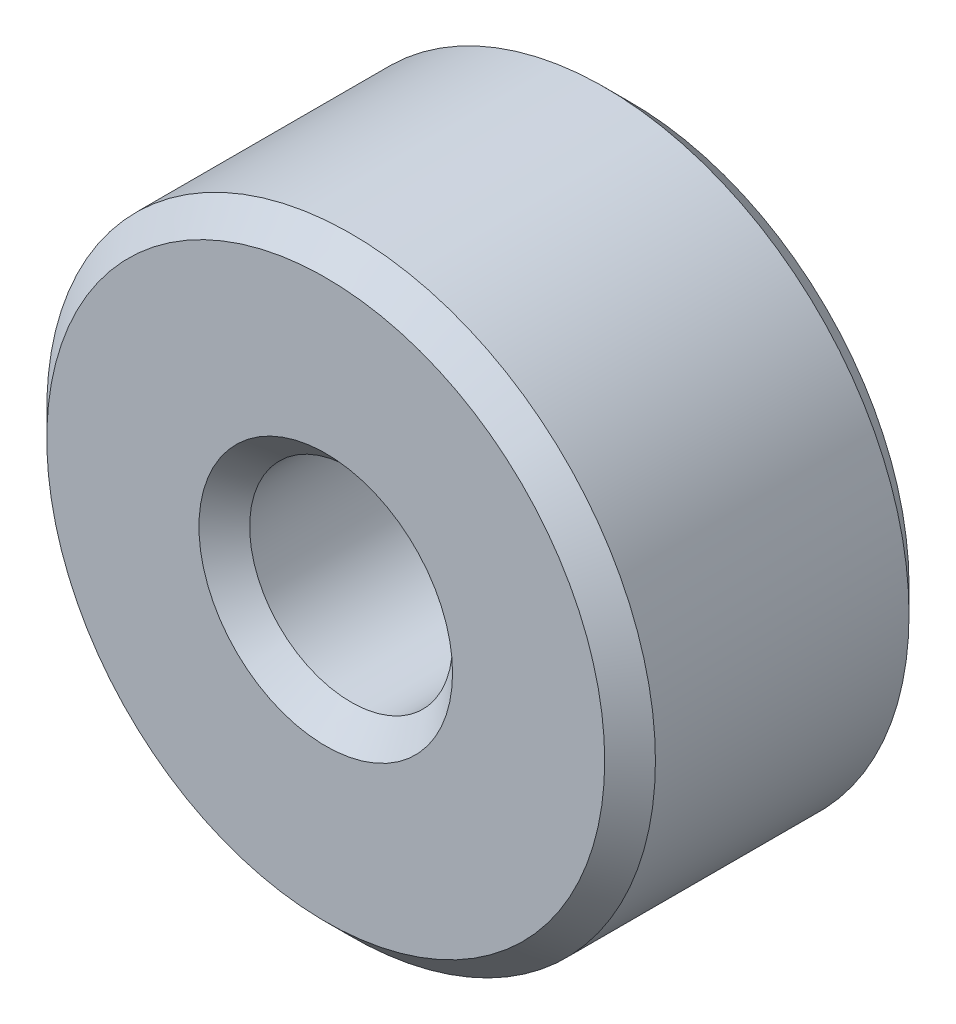
ISO-10303-21;
HEADER;
FILE_DESCRIPTION(('STEP AP214'),'2;1');
FILE_NAME('part.step','',(''),(''),'','','');
FILE_SCHEMA(('AUTOMOTIVE_DESIGN { 1 0 10303 214 1 1 1 1 }'));
ENDSEC;
DATA;
#1=APPLICATION_CONTEXT('core data for automotive mechanical design processes');
#2=APPLICATION_PROTOCOL_DEFINITION('international standard','automotive_design',2000,#1);
#3=PRODUCT_CONTEXT('',#1,'mechanical');
#4=PRODUCT('Part','Part','',(#3));
#5=PRODUCT_RELATED_PRODUCT_CATEGORY('part','',(#4));
#6=PRODUCT_DEFINITION_FORMATION('','',#4);
#7=PRODUCT_DEFINITION_CONTEXT('part definition',#1,'design');
#8=PRODUCT_DEFINITION('design','',#6,#7);
#9=PRODUCT_DEFINITION_SHAPE('','',#8);
#10=(LENGTH_UNIT() NAMED_UNIT(*) SI_UNIT(.MILLI.,.METRE.));
#11=(NAMED_UNIT(*) PLANE_ANGLE_UNIT() SI_UNIT($,.RADIAN.));
#12=(NAMED_UNIT(*) SI_UNIT($,.STERADIAN.) SOLID_ANGLE_UNIT());
#13=UNCERTAINTY_MEASURE_WITH_UNIT(LENGTH_MEASURE(1.E-05),#10,'distance_accuracy_value','');
#14=(GEOMETRIC_REPRESENTATION_CONTEXT(3) GLOBAL_UNCERTAINTY_ASSIGNED_CONTEXT((#13)) GLOBAL_UNIT_ASSIGNED_CONTEXT((#10,
#11,#12)) REPRESENTATION_CONTEXT('',''));
#15=CARTESIAN_POINT('',(0.,0.,0.));
#16=DIRECTION('',(0.,0.,1.));
#17=DIRECTION('',(1.,0.,0.));
#18=AXIS2_PLACEMENT_3D('',#15,#16,#17);
#19=CARTESIAN_POINT('',(0.,0.,3.));
#20=DIRECTION('',(0.,0.,1.));
#21=DIRECTION('',(1.,0.,0.));
#22=AXIS2_PLACEMENT_3D('',#19,#20,#21);
#23=PLANE('',#22);
#24=CARTESIAN_POINT('',(0.,0.,3.));
#25=DIRECTION('',(0.,0.,1.));
#26=DIRECTION('',(1.,0.,0.));
#27=AXIS2_PLACEMENT_3D('',#24,#25,#26);
#28=CIRCLE('',#27,1.25);
#29=CARTESIAN_POINT('',(1.25,0.,3.));
#30=VERTEX_POINT('',#29);
#31=EDGE_CURVE('E60',#30,#30,#28,.F.);
#32=ORIENTED_EDGE('',*,*,#31,.T.);
#33=EDGE_LOOP('',(#32));
#34=FACE_BOUND('',#33,.T.);
#35=CARTESIAN_POINT('',(0.,0.,3.));
#36=DIRECTION('',(0.,0.,1.));
#37=DIRECTION('',(1.,0.,0.));
#38=AXIS2_PLACEMENT_3D('',#35,#36,#37);
#39=CIRCLE('',#38,2.75);
#40=CARTESIAN_POINT('',(2.75,0.,3.));
#41=VERTEX_POINT('',#40);
#42=EDGE_CURVE('E63',#41,#41,#39,.T.);
#43=ORIENTED_EDGE('',*,*,#42,.T.);
#44=EDGE_LOOP('',(#43));
#45=FACE_BOUND('',#44,.T.);
#46=ADVANCED_FACE('F39',(#34,#45),#23,.T.);
#47=CARTESIAN_POINT('',(0.,0.,0.));
#48=DIRECTION('',(0.,0.,1.));
#49=DIRECTION('',(1.,0.,0.));
#50=AXIS2_PLACEMENT_3D('',#47,#48,#49);
#51=PLANE('',#50);
#52=CARTESIAN_POINT('',(0.,0.,0.));
#53=DIRECTION('',(0.,0.,1.));
#54=DIRECTION('',(1.,0.,0.));
#55=AXIS2_PLACEMENT_3D('',#52,#53,#54);
#56=CIRCLE('',#55,1.25);
#57=CARTESIAN_POINT('',(1.25,0.,0.));
#58=VERTEX_POINT('',#57);
#59=EDGE_CURVE('E11',#58,#58,#56,.T.);
#60=ORIENTED_EDGE('',*,*,#59,.T.);
#61=EDGE_LOOP('',(#60));
#62=FACE_BOUND('',#61,.T.);
#63=CARTESIAN_POINT('',(0.,0.,0.));
#64=DIRECTION('',(0.,0.,1.));
#65=DIRECTION('',(1.,0.,0.));
#66=AXIS2_PLACEMENT_3D('',#63,#64,#65);
#67=CIRCLE('',#66,2.75);
#68=CARTESIAN_POINT('',(2.75,0.,0.));
#69=VERTEX_POINT('',#68);
#70=EDGE_CURVE('E47',#69,#69,#67,.F.);
#71=ORIENTED_EDGE('',*,*,#70,.T.);
#72=EDGE_LOOP('',(#71));
#73=FACE_BOUND('',#72,.T.);
#74=ADVANCED_FACE('F89',(#62,#73),#51,.F.);
#75=CARTESIAN_POINT('',(0.,0.,3.));
#76=DIRECTION('',(0.,0.,-1.));
#77=DIRECTION('',(-1.,0.,0.));
#78=AXIS2_PLACEMENT_3D('',#75,#76,#77);
#79=CYLINDRICAL_SURFACE('',#78,3.);
#80=CARTESIAN_POINT('',(0.,0.,2.75));
#81=DIRECTION('',(0.,0.,1.));
#82=DIRECTION('',(1.,0.,0.));
#83=AXIS2_PLACEMENT_3D('',#80,#81,#82);
#84=CIRCLE('',#83,3.);
#85=CARTESIAN_POINT('',(3.,0.,2.75));
#86=VERTEX_POINT('',#85);
#87=EDGE_CURVE('E51',#86,#86,#84,.F.);
#88=ORIENTED_EDGE('',*,*,#87,.T.);
#89=EDGE_LOOP('',(#88));
#90=FACE_BOUND('',#89,.T.);
#91=CARTESIAN_POINT('',(0.,0.,0.250000000000001));
#92=DIRECTION('',(0.,0.,1.));
#93=DIRECTION('',(1.,0.,0.));
#94=AXIS2_PLACEMENT_3D('',#91,#92,#93);
#95=CIRCLE('',#94,3.);
#96=CARTESIAN_POINT('',(3.,0.,0.250000000000001));
#97=VERTEX_POINT('',#96);
#98=EDGE_CURVE('E55',#97,#97,#95,.T.);
#99=ORIENTED_EDGE('',*,*,#98,.T.);
#100=EDGE_LOOP('',(#99));
#101=FACE_BOUND('',#100,.T.);
#102=ADVANCED_FACE('F95',(#90,#101),#79,.T.);
#103=CARTESIAN_POINT('',(0.,0.,3.));
#104=DIRECTION('',(0.,0.,-1.));
#105=DIRECTION('',(-1.,0.,0.));
#106=AXIS2_PLACEMENT_3D('',#103,#104,#105);
#107=CYLINDRICAL_SURFACE('',#106,1.);
#108=CARTESIAN_POINT('',(0.,0.,2.75));
#109=DIRECTION('',(0.,0.,1.));
#110=DIRECTION('',(1.,0.,0.));
#111=AXIS2_PLACEMENT_3D('',#108,#109,#110);
#112=CIRCLE('',#111,1.);
#113=CARTESIAN_POINT('',(1.,0.,2.75));
#114=VERTEX_POINT('',#113);
#115=EDGE_CURVE('E66',#114,#114,#112,.T.);
#116=ORIENTED_EDGE('',*,*,#115,.T.);
#117=EDGE_LOOP('',(#116));
#118=FACE_BOUND('',#117,.T.);
#119=CARTESIAN_POINT('',(0.,0.,0.250000000000001));
#120=DIRECTION('',(0.,0.,1.));
#121=DIRECTION('',(1.,0.,0.));
#122=AXIS2_PLACEMENT_3D('',#119,#120,#121);
#123=CIRCLE('',#122,1.);
#124=CARTESIAN_POINT('',(1.,0.,0.250000000000001));
#125=VERTEX_POINT('',#124);
#126=EDGE_CURVE('E69',#125,#125,#123,.F.);
#127=ORIENTED_EDGE('',*,*,#126,.T.);
#128=EDGE_LOOP('',(#127));
#129=FACE_BOUND('',#128,.T.);
#130=ADVANCED_FACE('F73',(#118,#129),#107,.F.);
#131=CARTESIAN_POINT('',(0.,0.,2.75));
#132=DIRECTION('',(0.,0.,1.));
#133=DIRECTION('',(1.,0.,0.));
#134=AXIS2_PLACEMENT_3D('',#131,#132,#133);
#135=CONICAL_SURFACE('',#134,1.,0.78539816339745);
#136=ORIENTED_EDGE('',*,*,#31,.F.);
#137=EDGE_LOOP('',(#136));
#138=FACE_BOUND('',#137,.T.);
#139=ORIENTED_EDGE('',*,*,#115,.F.);
#140=EDGE_LOOP('',(#139));
#141=FACE_BOUND('',#140,.T.);
#142=ADVANCED_FACE('F84',(#138,#141),#135,.F.);
#143=CARTESIAN_POINT('',(0.,0.,3.));
#144=DIRECTION('',(0.,0.,-1.));
#145=DIRECTION('',(-1.,0.,0.));
#146=AXIS2_PLACEMENT_3D('',#143,#144,#145);
#147=CONICAL_SURFACE('',#146,2.75,0.785398163397447);
#148=ORIENTED_EDGE('',*,*,#87,.F.);
#149=EDGE_LOOP('',(#148));
#150=FACE_BOUND('',#149,.T.);
#151=ORIENTED_EDGE('',*,*,#42,.F.);
#152=EDGE_LOOP('',(#151));
#153=FACE_BOUND('',#152,.T.);
#154=ADVANCED_FACE('F78',(#150,#153),#147,.T.);
#155=CARTESIAN_POINT('',(0.,0.,0.));
#156=DIRECTION('',(0.,0.,-1.));
#157=DIRECTION('',(-1.,0.,0.));
#158=AXIS2_PLACEMENT_3D('',#155,#156,#157);
#159=CONICAL_SURFACE('',#158,1.25,0.785398163397447);
#160=ORIENTED_EDGE('',*,*,#126,.F.);
#161=EDGE_LOOP('',(#160));
#162=FACE_BOUND('',#161,.T.);
#163=ORIENTED_EDGE('',*,*,#59,.F.);
#164=EDGE_LOOP('',(#163));
#165=FACE_BOUND('',#164,.T.);
#166=ADVANCED_FACE('F75',(#162,#165),#159,.F.);
#167=CARTESIAN_POINT('',(0.,0.,0.250000000000001));
#168=DIRECTION('',(0.,0.,1.));
#169=DIRECTION('',(1.,0.,0.));
#170=AXIS2_PLACEMENT_3D('',#167,#168,#169);
#171=CONICAL_SURFACE('',#170,3.,0.78539816339745);
#172=ORIENTED_EDGE('',*,*,#70,.F.);
#173=EDGE_LOOP('',(#172));
#174=FACE_BOUND('',#173,.T.);
#175=ORIENTED_EDGE('',*,*,#98,.F.);
#176=EDGE_LOOP('',(#175));
#177=FACE_BOUND('',#176,.T.);
#178=ADVANCED_FACE('F42',(#174,#177),#171,.T.);
#179=CLOSED_SHELL('',(#46,#74,#102,#130,#142,#154,#166,#178));
#180=MANIFOLD_SOLID_BREP('B2',#179);
#181=ADVANCED_BREP_SHAPE_REPRESENTATION('',(#18,#180),#14);
#182=SHAPE_DEFINITION_REPRESENTATION(#9,#181);
ENDSEC;
END-ISO-10303-21;
